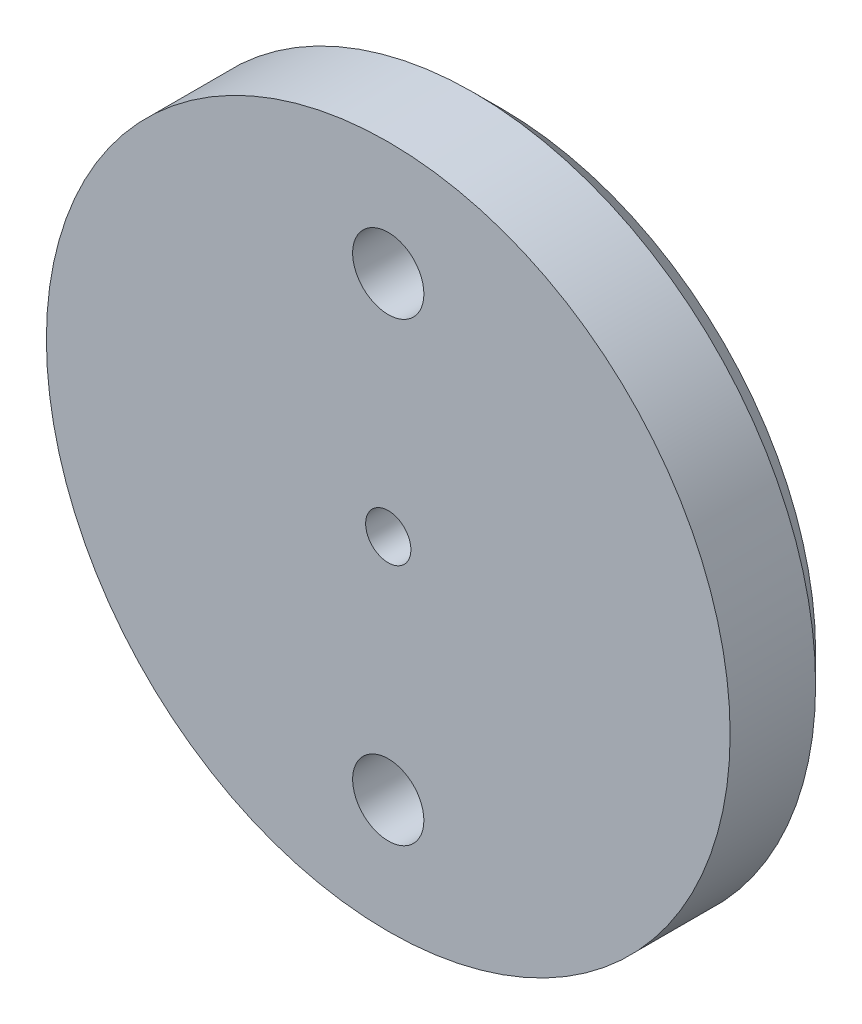
ISO-10303-21;
HEADER;
FILE_DESCRIPTION(('STEP AP214'),'2;1');
FILE_NAME('part.step','',(''),(''),'','','');
FILE_SCHEMA(('AUTOMOTIVE_DESIGN { 1 0 10303 214 1 1 1 1 }'));
ENDSEC;
DATA;
#1=APPLICATION_CONTEXT('core data for automotive mechanical design processes');
#2=APPLICATION_PROTOCOL_DEFINITION('international standard','automotive_design',2000,#1);
#3=PRODUCT_CONTEXT('',#1,'mechanical');
#4=PRODUCT('Part','Part','',(#3));
#5=PRODUCT_RELATED_PRODUCT_CATEGORY('part','',(#4));
#6=PRODUCT_DEFINITION_FORMATION('','',#4);
#7=PRODUCT_DEFINITION_CONTEXT('part definition',#1,'design');
#8=PRODUCT_DEFINITION('design','',#6,#7);
#9=PRODUCT_DEFINITION_SHAPE('','',#8);
#10=(LENGTH_UNIT() NAMED_UNIT(*) SI_UNIT(.MILLI.,.METRE.));
#11=(NAMED_UNIT(*) PLANE_ANGLE_UNIT() SI_UNIT($,.RADIAN.));
#12=(NAMED_UNIT(*) SI_UNIT($,.STERADIAN.) SOLID_ANGLE_UNIT());
#13=UNCERTAINTY_MEASURE_WITH_UNIT(LENGTH_MEASURE(1.E-05),#10,'distance_accuracy_value','');
#14=(GEOMETRIC_REPRESENTATION_CONTEXT(3) GLOBAL_UNCERTAINTY_ASSIGNED_CONTEXT((#13)) GLOBAL_UNIT_ASSIGNED_CONTEXT((#10,
#11,#12)) REPRESENTATION_CONTEXT('',''));
#15=CARTESIAN_POINT('',(0.,0.,0.));
#16=DIRECTION('',(0.,0.,1.));
#17=DIRECTION('',(1.,0.,0.));
#18=AXIS2_PLACEMENT_3D('',#15,#16,#17);
#19=CARTESIAN_POINT('',(0.,0.,0.));
#20=DIRECTION('',(0.,0.,1.));
#21=DIRECTION('',(1.,0.,0.));
#22=AXIS2_PLACEMENT_3D('',#19,#20,#21);
#23=CYLINDRICAL_SURFACE('',#22,0.793749999999999);
#24=CARTESIAN_POINT('',(0.,0.,0.));
#25=DIRECTION('',(0.,0.,1.));
#26=DIRECTION('',(1.,0.,0.));
#27=AXIS2_PLACEMENT_3D('',#24,#25,#26);
#28=CIRCLE('',#27,0.79375);
#29=CARTESIAN_POINT('',(0.79375,0.,0.));
#30=VERTEX_POINT('',#29);
#31=EDGE_CURVE('E71',#30,#30,#28,.T.);
#32=ORIENTED_EDGE('',*,*,#31,.T.);
#33=EDGE_LOOP('',(#32));
#34=FACE_BOUND('',#33,.T.);
#35=CARTESIAN_POINT('',(0.,0.,-10.));
#36=DIRECTION('',(0.,0.,1.));
#37=DIRECTION('',(1.,0.,0.));
#38=AXIS2_PLACEMENT_3D('',#35,#36,#37);
#39=CIRCLE('',#38,0.793749999999999);
#40=CARTESIAN_POINT('',(0.793749999999999,0.,-10.));
#41=VERTEX_POINT('',#40);
#42=EDGE_CURVE('E75',#41,#41,#39,.T.);
#43=ORIENTED_EDGE('',*,*,#42,.F.);
#44=EDGE_LOOP('',(#43));
#45=FACE_BOUND('',#44,.T.);
#46=ADVANCED_FACE('F33',(#34,#45),#23,.F.);
#47=CARTESIAN_POINT('',(0.79375,0.,0.));
#48=DIRECTION('',(0.,0.,1.));
#49=DIRECTION('',(1.,0.,0.));
#50=AXIS2_PLACEMENT_3D('',#47,#48,#49);
#51=PLANE('',#50);
#52=CARTESIAN_POINT('',(0.,8.,0.));
#53=DIRECTION('',(0.,0.,1.));
#54=DIRECTION('',(1.,0.,0.));
#55=AXIS2_PLACEMENT_3D('',#52,#53,#54);
#56=CIRCLE('',#55,1.24999999999999);
#57=CARTESIAN_POINT('',(1.24999999999999,8.,0.));
#58=VERTEX_POINT('',#57);
#59=EDGE_CURVE('E89',#58,#58,#56,.T.);
#60=ORIENTED_EDGE('',*,*,#59,.F.);
#61=EDGE_LOOP('',(#60));
#62=FACE_BOUND('',#61,.T.);
#63=CARTESIAN_POINT('',(0.,-8.,0.));
#64=DIRECTION('',(0.,0.,1.));
#65=DIRECTION('',(1.,0.,0.));
#66=AXIS2_PLACEMENT_3D('',#63,#64,#65);
#67=CIRCLE('',#66,1.24999999999999);
#68=CARTESIAN_POINT('',(1.24999999999999,-8.,0.));
#69=VERTEX_POINT('',#68);
#70=EDGE_CURVE('E76',#69,#69,#67,.T.);
#71=ORIENTED_EDGE('',*,*,#70,.F.);
#72=EDGE_LOOP('',(#71));
#73=FACE_BOUND('',#72,.T.);
#74=CARTESIAN_POINT('',(0.,0.,0.));
#75=DIRECTION('',(0.,0.,1.));
#76=DIRECTION('',(1.,0.,0.));
#77=AXIS2_PLACEMENT_3D('',#74,#75,#76);
#78=CIRCLE('',#77,12.);
#79=CARTESIAN_POINT('',(12.,0.,0.));
#80=VERTEX_POINT('',#79);
#81=EDGE_CURVE('E79',#80,#80,#78,.T.);
#82=ORIENTED_EDGE('',*,*,#81,.T.);
#83=EDGE_LOOP('',(#82));
#84=FACE_BOUND('',#83,.T.);
#85=ORIENTED_EDGE('',*,*,#31,.F.);
#86=EDGE_LOOP('',(#85));
#87=FACE_BOUND('',#86,.T.);
#88=ADVANCED_FACE('F95',(#62,#73,#84,#87),#51,.T.);
#89=CARTESIAN_POINT('',(0.,0.,0.));
#90=DIRECTION('',(0.,0.,1.));
#91=DIRECTION('',(1.,0.,0.));
#92=AXIS2_PLACEMENT_3D('',#89,#90,#91);
#93=CYLINDRICAL_SURFACE('',#92,12.);
#94=CARTESIAN_POINT('',(0.,0.,-3.));
#95=DIRECTION('',(0.,0.,-1.));
#96=DIRECTION('',(-1.,0.,0.));
#97=AXIS2_PLACEMENT_3D('',#94,#95,#96);
#98=CIRCLE('',#97,12.);
#99=CARTESIAN_POINT('',(-12.,0.,-3.));
#100=VERTEX_POINT('',#99);
#101=EDGE_CURVE('E68',#100,#100,#98,.F.);
#102=ORIENTED_EDGE('',*,*,#101,.T.);
#103=EDGE_LOOP('',(#102));
#104=FACE_BOUND('',#103,.T.);
#105=ORIENTED_EDGE('',*,*,#81,.F.);
#106=EDGE_LOOP('',(#105));
#107=FACE_BOUND('',#106,.T.);
#108=ADVANCED_FACE('F98',(#104,#107),#93,.T.);
#109=CARTESIAN_POINT('',(12.,0.,-4.));
#110=DIRECTION('',(0.,0.,-1.));
#111=DIRECTION('',(-1.,0.,0.));
#112=AXIS2_PLACEMENT_3D('',#109,#110,#111);
#113=PLANE('',#112);
#114=CARTESIAN_POINT('',(0.,0.,-4.));
#115=DIRECTION('',(0.,0.,-1.));
#116=DIRECTION('',(-1.,0.,0.));
#117=AXIS2_PLACEMENT_3D('',#114,#115,#116);
#118=CIRCLE('',#117,2.0875);
#119=CARTESIAN_POINT('',(-2.0875,0.,-4.));
#120=VERTEX_POINT('',#119);
#121=EDGE_CURVE('E56',#120,#120,#118,.F.);
#122=ORIENTED_EDGE('',*,*,#121,.T.);
#123=EDGE_LOOP('',(#122));
#124=FACE_BOUND('',#123,.T.);
#125=CARTESIAN_POINT('',(0.,0.,-4.));
#126=DIRECTION('',(0.,0.,-1.));
#127=DIRECTION('',(-1.,0.,0.));
#128=AXIS2_PLACEMENT_3D('',#125,#126,#127);
#129=CIRCLE('',#128,11.);
#130=CARTESIAN_POINT('',(-11.,0.,-4.));
#131=VERTEX_POINT('',#130);
#132=EDGE_CURVE('E65',#131,#131,#129,.T.);
#133=ORIENTED_EDGE('',*,*,#132,.T.);
#134=EDGE_LOOP('',(#133));
#135=FACE_BOUND('',#134,.T.);
#136=CARTESIAN_POINT('',(0.,8.,-4.));
#137=DIRECTION('',(0.,0.,-1.));
#138=DIRECTION('',(-1.,0.,0.));
#139=AXIS2_PLACEMENT_3D('',#136,#137,#138);
#140=CIRCLE('',#139,1.24999999999999);
#141=CARTESIAN_POINT('',(-1.24999999999999,8.,-4.));
#142=VERTEX_POINT('',#141);
#143=EDGE_CURVE('E86',#142,#142,#140,.T.);
#144=ORIENTED_EDGE('',*,*,#143,.F.);
#145=EDGE_LOOP('',(#144));
#146=FACE_BOUND('',#145,.T.);
#147=CARTESIAN_POINT('',(0.,-8.,-4.));
#148=DIRECTION('',(0.,0.,-1.));
#149=DIRECTION('',(-1.,0.,0.));
#150=AXIS2_PLACEMENT_3D('',#147,#148,#149);
#151=CIRCLE('',#150,1.24999999999999);
#152=CARTESIAN_POINT('',(-1.24999999999999,-8.,-4.));
#153=VERTEX_POINT('',#152);
#154=EDGE_CURVE('E72',#153,#153,#151,.T.);
#155=ORIENTED_EDGE('',*,*,#154,.F.);
#156=EDGE_LOOP('',(#155));
#157=FACE_BOUND('',#156,.T.);
#158=ADVANCED_FACE('F133',(#124,#135,#146,#157),#113,.T.);
#159=CARTESIAN_POINT('',(0.,0.,0.));
#160=DIRECTION('',(0.,0.,1.));
#161=DIRECTION('',(1.,0.,0.));
#162=AXIS2_PLACEMENT_3D('',#159,#160,#161);
#163=CYLINDRICAL_SURFACE('',#162,1.5875);
#164=CARTESIAN_POINT('',(0.,0.,-7.85));
#165=DIRECTION('',(0.,0.,1.));
#166=DIRECTION('',(1.,0.,0.));
#167=AXIS2_PLACEMENT_3D('',#164,#165,#166);
#168=CIRCLE('',#167,1.5875);
#169=CARTESIAN_POINT('',(1.5875,0.,-7.85));
#170=VERTEX_POINT('',#169);
#171=EDGE_CURVE('E10',#170,#170,#168,.T.);
#172=ORIENTED_EDGE('',*,*,#171,.T.);
#173=EDGE_LOOP('',(#172));
#174=FACE_BOUND('',#173,.T.);
#175=CARTESIAN_POINT('',(0.,0.,-4.5));
#176=DIRECTION('',(0.,0.,-1.));
#177=DIRECTION('',(-1.,0.,0.));
#178=AXIS2_PLACEMENT_3D('',#175,#176,#177);
#179=CIRCLE('',#178,1.5875);
#180=CARTESIAN_POINT('',(-1.5875,0.,-4.5));
#181=VERTEX_POINT('',#180);
#182=EDGE_CURVE('E53',#181,#181,#179,.T.);
#183=ORIENTED_EDGE('',*,*,#182,.T.);
#184=EDGE_LOOP('',(#183));
#185=FACE_BOUND('',#184,.T.);
#186=ADVANCED_FACE('F129',(#174,#185),#163,.T.);
#187=CARTESIAN_POINT('',(1.5875,0.,-8.));
#188=DIRECTION('',(0.,0.,1.));
#189=DIRECTION('',(1.,0.,0.));
#190=AXIS2_PLACEMENT_3D('',#187,#188,#189);
#191=PLANE('',#190);
#192=CARTESIAN_POINT('',(0.,0.,-8.));
#193=DIRECTION('',(0.,0.,1.));
#194=DIRECTION('',(1.,0.,0.));
#195=AXIS2_PLACEMENT_3D('',#192,#193,#194);
#196=CIRCLE('',#195,1.80451619407382);
#197=CARTESIAN_POINT('',(1.80451619407382,0.,-8.));
#198=VERTEX_POINT('',#197);
#199=EDGE_CURVE('E44',#198,#198,#196,.T.);
#200=ORIENTED_EDGE('',*,*,#199,.T.);
#201=EDGE_LOOP('',(#200));
#202=FACE_BOUND('',#201,.T.);
#203=CARTESIAN_POINT('',(0.,0.,-8.));
#204=DIRECTION('',(0.,0.,1.));
#205=DIRECTION('',(1.,0.,0.));
#206=AXIS2_PLACEMENT_3D('',#203,#204,#205);
#207=CIRCLE('',#206,1.7375);
#208=CARTESIAN_POINT('',(1.7375,0.,-8.));
#209=VERTEX_POINT('',#208);
#210=EDGE_CURVE('E48',#209,#209,#207,.F.);
#211=ORIENTED_EDGE('',*,*,#210,.T.);
#212=EDGE_LOOP('',(#211));
#213=FACE_BOUND('',#212,.T.);
#214=ADVANCED_FACE('F123',(#202,#213),#191,.T.);
#215=CARTESIAN_POINT('',(0.,0.,-8.));
#216=DIRECTION('',(0.,0.,1.));
#217=DIRECTION('',(1.,0.,0.));
#218=AXIS2_PLACEMENT_3D('',#215,#216,#217);
#219=CONICAL_SURFACE('',#218,2.,0.261799387799143);
#220=CARTESIAN_POINT('',(0.,0.,-8.18882285676538));
#221=DIRECTION('',(0.,0.,-1.));
#222=DIRECTION('',(-1.,0.,0.));
#223=AXIS2_PLACEMENT_3D('',#220,#221,#222);
#224=CIRCLE('',#223,1.94940506801718);
#225=CARTESIAN_POINT('',(-1.94940506801718,0.,-8.18882285676538));
#226=VERTEX_POINT('',#225);
#227=EDGE_CURVE('E40',#226,#226,#224,.T.);
#228=ORIENTED_EDGE('',*,*,#227,.T.);
#229=EDGE_LOOP('',(#228));
#230=FACE_BOUND('',#229,.T.);
#231=CARTESIAN_POINT('',(0.,0.,-9.62940952255126));
#232=DIRECTION('',(0.,0.,-1.));
#233=DIRECTION('',(-1.,0.,0.));
#234=AXIS2_PLACEMENT_3D('',#231,#232,#233);
#235=CIRCLE('',#234,1.56340103429282);
#236=CARTESIAN_POINT('',(-1.56340103429282,0.,-9.62940952255126));
#237=VERTEX_POINT('',#236);
#238=EDGE_CURVE('E62',#237,#237,#235,.F.);
#239=ORIENTED_EDGE('',*,*,#238,.T.);
#240=EDGE_LOOP('',(#239));
#241=FACE_BOUND('',#240,.T.);
#242=ADVANCED_FACE('F114',(#230,#241),#219,.T.);
#243=CARTESIAN_POINT('',(1.46410161513777,0.,-10.));
#244=DIRECTION('',(0.,0.,-1.));
#245=DIRECTION('',(-1.,0.,0.));
#246=AXIS2_PLACEMENT_3D('',#243,#244,#245);
#247=PLANE('',#246);
#248=CARTESIAN_POINT('',(0.,0.,-10.));
#249=DIRECTION('',(0.,0.,-1.));
#250=DIRECTION('',(-1.,0.,0.));
#251=AXIS2_PLACEMENT_3D('',#248,#249,#250);
#252=CIRCLE('',#251,1.08043812114828);
#253=CARTESIAN_POINT('',(-1.08043812114828,0.,-10.));
#254=VERTEX_POINT('',#253);
#255=EDGE_CURVE('E59',#254,#254,#252,.T.);
#256=ORIENTED_EDGE('',*,*,#255,.T.);
#257=EDGE_LOOP('',(#256));
#258=FACE_BOUND('',#257,.T.);
#259=ORIENTED_EDGE('',*,*,#42,.T.);
#260=EDGE_LOOP('',(#259));
#261=FACE_BOUND('',#260,.T.);
#262=ADVANCED_FACE('F111',(#258,#261),#247,.T.);
#263=CARTESIAN_POINT('',(0.,-8.,0.));
#264=DIRECTION('',(0.,0.,1.));
#265=DIRECTION('',(1.,0.,0.));
#266=AXIS2_PLACEMENT_3D('',#263,#264,#265);
#267=CYLINDRICAL_SURFACE('',#266,1.24999999999999);
#268=ORIENTED_EDGE('',*,*,#154,.T.);
#269=EDGE_LOOP('',(#268));
#270=FACE_BOUND('',#269,.T.);
#271=ORIENTED_EDGE('',*,*,#70,.T.);
#272=EDGE_LOOP('',(#271));
#273=FACE_BOUND('',#272,.T.);
#274=ADVANCED_FACE('F113',(#270,#273),#267,.F.);
#275=CARTESIAN_POINT('',(0.,8.,0.));
#276=DIRECTION('',(0.,0.,1.));
#277=DIRECTION('',(1.,0.,0.));
#278=AXIS2_PLACEMENT_3D('',#275,#276,#277);
#279=CYLINDRICAL_SURFACE('',#278,1.24999999999999);
#280=ORIENTED_EDGE('',*,*,#143,.T.);
#281=EDGE_LOOP('',(#280));
#282=FACE_BOUND('',#281,.T.);
#283=ORIENTED_EDGE('',*,*,#59,.T.);
#284=EDGE_LOOP('',(#283));
#285=FACE_BOUND('',#284,.T.);
#286=ADVANCED_FACE('F93',(#282,#285),#279,.F.);
#287=CARTESIAN_POINT('',(0.,0.,-3.));
#288=DIRECTION('',(0.,0.,1.));
#289=DIRECTION('',(1.,0.,0.));
#290=AXIS2_PLACEMENT_3D('',#287,#288,#289);
#291=CONICAL_SURFACE('',#290,12.,0.785398163397448);
#292=ORIENTED_EDGE('',*,*,#132,.F.);
#293=EDGE_LOOP('',(#292));
#294=FACE_BOUND('',#293,.T.);
#295=ORIENTED_EDGE('',*,*,#101,.F.);
#296=EDGE_LOOP('',(#295));
#297=FACE_BOUND('',#296,.T.);
#298=ADVANCED_FACE('F141',(#294,#297),#291,.T.);
#299=CARTESIAN_POINT('',(0.,0.,-9.5));
#300=DIRECTION('',(0.,0.,-1.));
#301=DIRECTION('',(-1.,0.,0.));
#302=AXIS2_PLACEMENT_3D('',#299,#300,#301);
#303=TOROIDAL_SURFACE('',#302,1.08043812114828,0.5);
#304=ORIENTED_EDGE('',*,*,#255,.F.);
#305=EDGE_LOOP('',(#304));
#306=FACE_BOUND('',#305,.T.);
#307=ORIENTED_EDGE('',*,*,#238,.F.);
#308=EDGE_LOOP('',(#307));
#309=FACE_BOUND('',#308,.T.);
#310=ADVANCED_FACE('F146',(#306,#309),#303,.T.);
#311=CARTESIAN_POINT('',(0.,0.,-4.5));
#312=DIRECTION('',(0.,0.,-1.));
#313=DIRECTION('',(-1.,0.,0.));
#314=AXIS2_PLACEMENT_3D('',#311,#312,#313);
#315=TOROIDAL_SURFACE('',#314,2.0875,0.5);
#316=ORIENTED_EDGE('',*,*,#182,.F.);
#317=EDGE_LOOP('',(#316));
#318=FACE_BOUND('',#317,.T.);
#319=ORIENTED_EDGE('',*,*,#121,.F.);
#320=EDGE_LOOP('',(#319));
#321=FACE_BOUND('',#320,.T.);
#322=ADVANCED_FACE('F150',(#318,#321),#315,.F.);
#323=CARTESIAN_POINT('',(0.,0.,-8.15));
#324=DIRECTION('',(0.,0.,1.));
#325=DIRECTION('',(1.,0.,0.));
#326=AXIS2_PLACEMENT_3D('',#323,#324,#325);
#327=TOROIDAL_SURFACE('',#326,1.80451619407382,0.15);
#328=ORIENTED_EDGE('',*,*,#227,.F.);
#329=EDGE_LOOP('',(#328));
#330=FACE_BOUND('',#329,.T.);
#331=ORIENTED_EDGE('',*,*,#199,.F.);
#332=EDGE_LOOP('',(#331));
#333=FACE_BOUND('',#332,.T.);
#334=ADVANCED_FACE('F153',(#330,#333),#327,.T.);
#335=CARTESIAN_POINT('',(0.,0.,-7.85));
#336=DIRECTION('',(0.,0.,1.));
#337=DIRECTION('',(1.,0.,0.));
#338=AXIS2_PLACEMENT_3D('',#335,#336,#337);
#339=TOROIDAL_SURFACE('',#338,1.7375,0.15);
#340=ORIENTED_EDGE('',*,*,#210,.F.);
#341=EDGE_LOOP('',(#340));
#342=FACE_BOUND('',#341,.T.);
#343=ORIENTED_EDGE('',*,*,#171,.F.);
#344=EDGE_LOOP('',(#343));
#345=FACE_BOUND('',#344,.T.);
#346=ADVANCED_FACE('F35',(#342,#345),#339,.F.);
#347=CLOSED_SHELL('',(#46,#88,#108,#158,#186,#214,#242,#262,#274,#286,#298,#310,#322,#334,#346));
#348=MANIFOLD_SOLID_BREP('B2',#347);
#349=ADVANCED_BREP_SHAPE_REPRESENTATION('',(#18,#348),#14);
#350=SHAPE_DEFINITION_REPRESENTATION(#9,#349);
ENDSEC;
END-ISO-10303-21;
